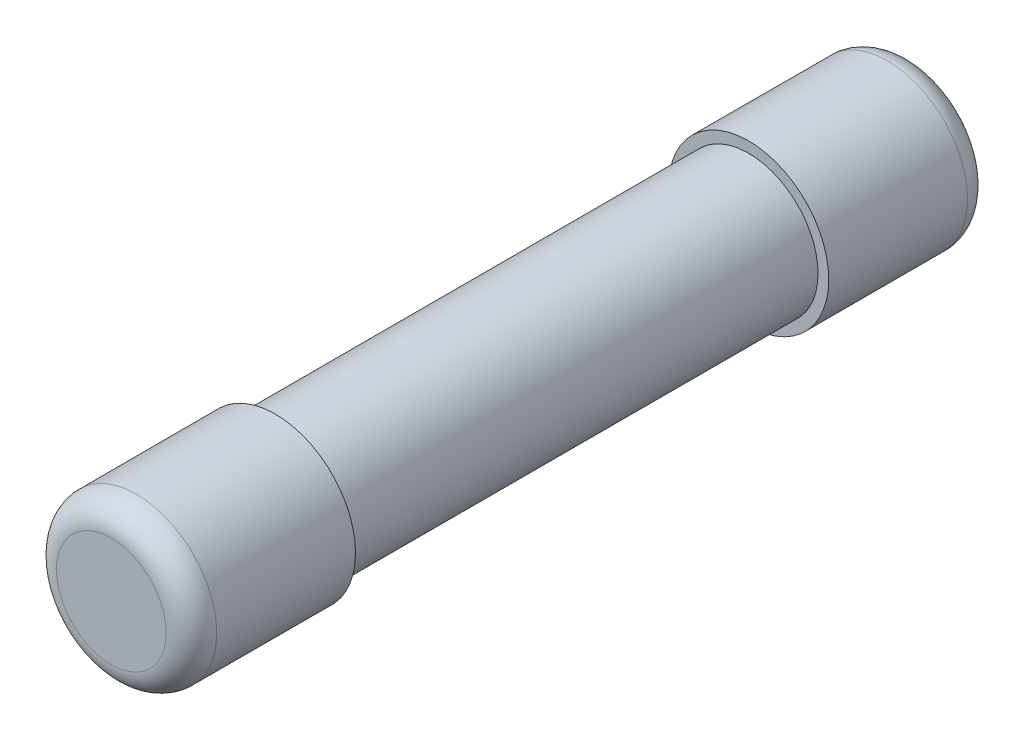
ISO-10303-21;
HEADER;
FILE_DESCRIPTION(('STEP AP214'),'2;1');
FILE_NAME('part.step','',(''),(''),'','','');
FILE_SCHEMA(('AUTOMOTIVE_DESIGN { 1 0 10303 214 1 1 1 1 }'));
ENDSEC;
DATA;
#1=APPLICATION_CONTEXT('core data for automotive mechanical design processes');
#2=APPLICATION_PROTOCOL_DEFINITION('international standard','automotive_design',2000,#1);
#3=PRODUCT_CONTEXT('',#1,'mechanical');
#4=PRODUCT('Part','Part','',(#3));
#5=PRODUCT_RELATED_PRODUCT_CATEGORY('part','',(#4));
#6=PRODUCT_DEFINITION_FORMATION('','',#4);
#7=PRODUCT_DEFINITION_CONTEXT('part definition',#1,'design');
#8=PRODUCT_DEFINITION('design','',#6,#7);
#9=PRODUCT_DEFINITION_SHAPE('','',#8);
#10=(LENGTH_UNIT() NAMED_UNIT(*) SI_UNIT(.MILLI.,.METRE.));
#11=(NAMED_UNIT(*) PLANE_ANGLE_UNIT() SI_UNIT($,.RADIAN.));
#12=(NAMED_UNIT(*) SI_UNIT($,.STERADIAN.) SOLID_ANGLE_UNIT());
#13=UNCERTAINTY_MEASURE_WITH_UNIT(LENGTH_MEASURE(1.E-05),#10,'distance_accuracy_value','');
#14=(GEOMETRIC_REPRESENTATION_CONTEXT(3) GLOBAL_UNCERTAINTY_ASSIGNED_CONTEXT((#13)) GLOBAL_UNIT_ASSIGNED_CONTEXT((#10,
#11,#12)) REPRESENTATION_CONTEXT('',''));
#15=CARTESIAN_POINT('',(0.,0.,0.));
#16=DIRECTION('',(0.,0.,1.));
#17=DIRECTION('',(1.,0.,0.));
#18=AXIS2_PLACEMENT_3D('',#15,#16,#17);
#19=CARTESIAN_POINT('',(0.,0.,-15.875));
#20=DIRECTION('',(0.,0.,-1.));
#21=DIRECTION('',(1.,0.,0.));
#22=AXIS2_PLACEMENT_3D('',#19,#20,#21);
#23=CYLINDRICAL_SURFACE('',#22,2.74955);
#24=CARTESIAN_POINT('',(0.,0.,-9.375775));
#25=DIRECTION('',(0.,0.,1.));
#26=DIRECTION('',(1.,0.,0.));
#27=AXIS2_PLACEMENT_3D('',#24,#25,#26);
#28=CIRCLE('',#27,2.74955);
#29=CARTESIAN_POINT('',(2.74955,0.,-9.375775));
#30=VERTEX_POINT('',#29);
#31=EDGE_CURVE('E64',#30,#30,#28,.T.);
#32=ORIENTED_EDGE('',*,*,#31,.T.);
#33=EDGE_LOOP('',(#32));
#34=FACE_BOUND('',#33,.T.);
#35=CARTESIAN_POINT('',(0.,0.,-14.84391875));
#36=DIRECTION('',(0.,0.,1.));
#37=DIRECTION('',(1.,0.,0.));
#38=AXIS2_PLACEMENT_3D('',#35,#36,#37);
#39=CIRCLE('',#38,2.74955);
#40=CARTESIAN_POINT('',(2.74955,0.,-14.84391875));
#41=VERTEX_POINT('',#40);
#42=EDGE_CURVE('E76',#41,#41,#39,.T.);
#43=ORIENTED_EDGE('',*,*,#42,.F.);
#44=EDGE_LOOP('',(#43));
#45=FACE_BOUND('',#44,.T.);
#46=ADVANCED_FACE('F50',(#34,#45),#23,.F.);
#47=CARTESIAN_POINT('',(0.,2.74955,-9.375775));
#48=DIRECTION('',(0.,0.,-1.));
#49=DIRECTION('',(1.,0.,0.));
#50=AXIS2_PLACEMENT_3D('',#47,#48,#49);
#51=PLANE('',#50);
#52=CARTESIAN_POINT('',(0.,0.,-9.375775));
#53=DIRECTION('',(0.,0.,1.));
#54=DIRECTION('',(1.,0.,0.));
#55=AXIS2_PLACEMENT_3D('',#52,#53,#54);
#56=CIRCLE('',#55,3.17500000000006);
#57=CARTESIAN_POINT('',(3.17500000000006,0.,-9.375775));
#58=VERTEX_POINT('',#57);
#59=EDGE_CURVE('E70',#58,#58,#56,.T.);
#60=ORIENTED_EDGE('',*,*,#59,.T.);
#61=EDGE_LOOP('',(#60));
#62=FACE_BOUND('',#61,.T.);
#63=ORIENTED_EDGE('',*,*,#31,.F.);
#64=EDGE_LOOP('',(#63));
#65=FACE_BOUND('',#64,.T.);
#66=ADVANCED_FACE('F85',(#62,#65),#51,.F.);
#67=CARTESIAN_POINT('',(0.,0.,-15.875));
#68=DIRECTION('',(0.,0.,-1.));
#69=DIRECTION('',(1.,0.,0.));
#70=AXIS2_PLACEMENT_3D('',#67,#68,#69);
#71=CYLINDRICAL_SURFACE('',#70,3.17500000000006);
#72=CARTESIAN_POINT('',(0.,0.,-14.875));
#73=DIRECTION('',(0.,0.,-1.));
#74=DIRECTION('',(-1.,0.,0.));
#75=AXIS2_PLACEMENT_3D('',#72,#73,#74);
#76=CIRCLE('',#75,3.17500000000006);
#77=CARTESIAN_POINT('',(-3.17500000000006,0.,-14.875));
#78=VERTEX_POINT('',#77);
#79=EDGE_CURVE('E11',#78,#78,#76,.T.);
#80=ORIENTED_EDGE('',*,*,#79,.F.);
#81=EDGE_LOOP('',(#80));
#82=FACE_BOUND('',#81,.T.);
#83=ORIENTED_EDGE('',*,*,#59,.F.);
#84=EDGE_LOOP('',(#83));
#85=FACE_BOUND('',#84,.T.);
#86=ADVANCED_FACE('F90',(#82,#85),#71,.T.);
#87=CARTESIAN_POINT('',(0.,3.17500000000006,-15.875));
#88=DIRECTION('',(0.,0.,1.));
#89=DIRECTION('',(-1.,0.,0.));
#90=AXIS2_PLACEMENT_3D('',#87,#88,#89);
#91=PLANE('',#90);
#92=CARTESIAN_POINT('',(0.,0.,-15.875));
#93=DIRECTION('',(0.,0.,-1.));
#94=DIRECTION('',(-1.,0.,0.));
#95=AXIS2_PLACEMENT_3D('',#92,#93,#94);
#96=CIRCLE('',#95,2.17500000000006);
#97=CARTESIAN_POINT('',(-2.17500000000006,0.,-15.875));
#98=VERTEX_POINT('',#97);
#99=EDGE_CURVE('E58',#98,#98,#96,.F.);
#100=ORIENTED_EDGE('',*,*,#99,.F.);
#101=EDGE_LOOP('',(#100));
#102=FACE_BOUND('',#101,.T.);
#103=ADVANCED_FACE('F96',(#102),#91,.F.);
#104=CARTESIAN_POINT('',(0.,0.,-14.84391875));
#105=DIRECTION('',(0.,0.,-1.));
#106=DIRECTION('',(1.,0.,0.));
#107=AXIS2_PLACEMENT_3D('',#104,#105,#106);
#108=PLANE('',#107);
#109=ORIENTED_EDGE('',*,*,#42,.T.);
#110=EDGE_LOOP('',(#109));
#111=FACE_BOUND('',#110,.T.);
#112=ADVANCED_FACE('F82',(#111),#108,.F.);
#113=CARTESIAN_POINT('',(0.,0.,-14.875));
#114=DIRECTION('',(0.,0.,1.));
#115=DIRECTION('',(-1.,0.,0.));
#116=AXIS2_PLACEMENT_3D('',#113,#114,#115);
#117=TOROIDAL_SURFACE('',#116,2.17500000000006,1.);
#118=ORIENTED_EDGE('',*,*,#79,.T.);
#119=EDGE_LOOP('',(#118));
#120=FACE_BOUND('',#119,.T.);
#121=ORIENTED_EDGE('',*,*,#99,.T.);
#122=EDGE_LOOP('',(#121));
#123=FACE_BOUND('',#122,.T.);
#124=ADVANCED_FACE('F52',(#120,#123),#117,.T.);
#125=CLOSED_SHELL('',(#46,#66,#86,#103,#112,#124));
#126=MANIFOLD_SOLID_BREP('B2',#125);
#127=CARTESIAN_POINT('',(0.,0.,15.875));
#128=DIRECTION('',(0.,0.,1.));
#129=DIRECTION('',(1.,0.,0.));
#130=AXIS2_PLACEMENT_3D('',#127,#128,#129);
#131=CYLINDRICAL_SURFACE('',#130,2.74955);
#132=CARTESIAN_POINT('',(0.,0.,9.375775));
#133=DIRECTION('',(0.,0.,1.));
#134=DIRECTION('',(1.,0.,0.));
#135=AXIS2_PLACEMENT_3D('',#132,#133,#134);
#136=CIRCLE('',#135,2.74955);
#137=CARTESIAN_POINT('',(2.74955,0.,9.375775));
#138=VERTEX_POINT('',#137);
#139=EDGE_CURVE('E167',#138,#138,#136,.T.);
#140=ORIENTED_EDGE('',*,*,#139,.F.);
#141=EDGE_LOOP('',(#140));
#142=FACE_BOUND('',#141,.T.);
#143=CARTESIAN_POINT('',(0.,0.,14.84391875));
#144=DIRECTION('',(0.,0.,1.));
#145=DIRECTION('',(1.,0.,0.));
#146=AXIS2_PLACEMENT_3D('',#143,#144,#145);
#147=CIRCLE('',#146,2.74955);
#148=CARTESIAN_POINT('',(2.74955,0.,14.84391875));
#149=VERTEX_POINT('',#148);
#150=EDGE_CURVE('E179',#149,#149,#147,.T.);
#151=ORIENTED_EDGE('',*,*,#150,.T.);
#152=EDGE_LOOP('',(#151));
#153=FACE_BOUND('',#152,.T.);
#154=ADVANCED_FACE('F153',(#142,#153),#131,.F.);
#155=CARTESIAN_POINT('',(0.,2.74955,9.375775));
#156=DIRECTION('',(0.,0.,1.));
#157=DIRECTION('',(1.,0.,0.));
#158=AXIS2_PLACEMENT_3D('',#155,#156,#157);
#159=PLANE('',#158);
#160=CARTESIAN_POINT('',(0.,0.,9.375775));
#161=DIRECTION('',(0.,0.,1.));
#162=DIRECTION('',(1.,0.,0.));
#163=AXIS2_PLACEMENT_3D('',#160,#161,#162);
#164=CIRCLE('',#163,3.17500000000006);
#165=CARTESIAN_POINT('',(3.17500000000006,0.,9.375775));
#166=VERTEX_POINT('',#165);
#167=EDGE_CURVE('E173',#166,#166,#164,.T.);
#168=ORIENTED_EDGE('',*,*,#167,.F.);
#169=EDGE_LOOP('',(#168));
#170=FACE_BOUND('',#169,.T.);
#171=ORIENTED_EDGE('',*,*,#139,.T.);
#172=EDGE_LOOP('',(#171));
#173=FACE_BOUND('',#172,.T.);
#174=ADVANCED_FACE('F198',(#170,#173),#159,.F.);
#175=CARTESIAN_POINT('',(0.,0.,15.875));
#176=DIRECTION('',(0.,0.,1.));
#177=DIRECTION('',(1.,0.,0.));
#178=AXIS2_PLACEMENT_3D('',#175,#176,#177);
#179=CYLINDRICAL_SURFACE('',#178,3.17500000000006);
#180=CARTESIAN_POINT('',(0.,0.,14.875));
#181=DIRECTION('',(0.,0.,-1.));
#182=DIRECTION('',(-1.,0.,0.));
#183=AXIS2_PLACEMENT_3D('',#180,#181,#182);
#184=CIRCLE('',#183,3.17500000000006);
#185=CARTESIAN_POINT('',(-3.17500000000006,0.,14.875));
#186=VERTEX_POINT('',#185);
#187=EDGE_CURVE('E49',#186,#186,#184,.T.);
#188=ORIENTED_EDGE('',*,*,#187,.T.);
#189=EDGE_LOOP('',(#188));
#190=FACE_BOUND('',#189,.T.);
#191=ORIENTED_EDGE('',*,*,#167,.T.);
#192=EDGE_LOOP('',(#191));
#193=FACE_BOUND('',#192,.T.);
#194=ADVANCED_FACE('F195',(#190,#193),#179,.T.);
#195=CARTESIAN_POINT('',(0.,3.17500000000006,15.875));
#196=DIRECTION('',(0.,0.,-1.));
#197=DIRECTION('',(-1.,0.,0.));
#198=AXIS2_PLACEMENT_3D('',#195,#196,#197);
#199=PLANE('',#198);
#200=CARTESIAN_POINT('',(0.,0.,15.875));
#201=DIRECTION('',(0.,0.,-1.));
#202=DIRECTION('',(-1.,0.,0.));
#203=AXIS2_PLACEMENT_3D('',#200,#201,#202);
#204=CIRCLE('',#203,2.17500000000006);
#205=CARTESIAN_POINT('',(-2.17500000000006,0.,15.875));
#206=VERTEX_POINT('',#205);
#207=EDGE_CURVE('E161',#206,#206,#204,.F.);
#208=ORIENTED_EDGE('',*,*,#207,.T.);
#209=EDGE_LOOP('',(#208));
#210=FACE_BOUND('',#209,.T.);
#211=ADVANCED_FACE('F188',(#210),#199,.F.);
#212=CARTESIAN_POINT('',(0.,0.,14.84391875));
#213=DIRECTION('',(0.,0.,1.));
#214=DIRECTION('',(1.,0.,0.));
#215=AXIS2_PLACEMENT_3D('',#212,#213,#214);
#216=PLANE('',#215);
#217=ORIENTED_EDGE('',*,*,#150,.F.);
#218=EDGE_LOOP('',(#217));
#219=FACE_BOUND('',#218,.T.);
#220=ADVANCED_FACE('F186',(#219),#216,.F.);
#221=CARTESIAN_POINT('',(0.,0.,14.875));
#222=DIRECTION('',(0.,0.,-1.));
#223=DIRECTION('',(-1.,0.,0.));
#224=AXIS2_PLACEMENT_3D('',#221,#222,#223);
#225=TOROIDAL_SURFACE('',#224,2.17500000000006,1.);
#226=ORIENTED_EDGE('',*,*,#187,.F.);
#227=EDGE_LOOP('',(#226));
#228=FACE_BOUND('',#227,.T.);
#229=ORIENTED_EDGE('',*,*,#207,.F.);
#230=EDGE_LOOP('',(#229));
#231=FACE_BOUND('',#230,.T.);
#232=ADVANCED_FACE('F155',(#228,#231),#225,.T.);
#233=CLOSED_SHELL('',(#154,#174,#194,#211,#220,#232));
#234=MANIFOLD_SOLID_BREP('B6',#233);
#235=CARTESIAN_POINT('',(0.,1.71846875,14.84391875));
#236=DIRECTION('',(0.,0.,-1.));
#237=DIRECTION('',(-1.,0.,0.));
#238=AXIS2_PLACEMENT_3D('',#235,#236,#237);
#239=PLANE('',#238);
#240=CARTESIAN_POINT('',(0.,0.,14.84391875));
#241=DIRECTION('',(0.,0.,1.));
#242=DIRECTION('',(1.,0.,0.));
#243=AXIS2_PLACEMENT_3D('',#240,#241,#242);
#244=CIRCLE('',#243,1.71846875);
#245=CARTESIAN_POINT('',(1.71846875,0.,14.84391875));
#246=VERTEX_POINT('',#245);
#247=EDGE_CURVE('E268',#246,#246,#244,.T.);
#248=ORIENTED_EDGE('',*,*,#247,.F.);
#249=EDGE_LOOP('',(#248));
#250=FACE_BOUND('',#249,.T.);
#251=CARTESIAN_POINT('',(0.,0.,14.84391875));
#252=DIRECTION('',(0.,0.,1.));
#253=DIRECTION('',(1.,0.,0.));
#254=AXIS2_PLACEMENT_3D('',#251,#252,#253);
#255=CIRCLE('',#254,2.74955);
#256=CARTESIAN_POINT('',(2.74955,0.,14.84391875));
#257=VERTEX_POINT('',#256);
#258=EDGE_CURVE('E152',#257,#257,#255,.T.);
#259=ORIENTED_EDGE('',*,*,#258,.T.);
#260=EDGE_LOOP('',(#259));
#261=FACE_BOUND('',#260,.T.);
#262=ADVANCED_FACE('F249',(#250,#261),#239,.F.);
#263=CARTESIAN_POINT('',(0.,0.,15.875));
#264=DIRECTION('',(0.,0.,1.));
#265=DIRECTION('',(1.,0.,0.));
#266=AXIS2_PLACEMENT_3D('',#263,#264,#265);
#267=CYLINDRICAL_SURFACE('',#266,2.74955);
#268=ORIENTED_EDGE('',*,*,#258,.F.);
#269=EDGE_LOOP('',(#268));
#270=FACE_BOUND('',#269,.T.);
#271=CARTESIAN_POINT('',(0.,0.,-14.84391875));
#272=DIRECTION('',(0.,0.,1.));
#273=DIRECTION('',(1.,0.,0.));
#274=AXIS2_PLACEMENT_3D('',#271,#272,#273);
#275=CIRCLE('',#274,2.74955);
#276=CARTESIAN_POINT('',(2.74955,0.,-14.84391875));
#277=VERTEX_POINT('',#276);
#278=EDGE_CURVE('E256',#277,#277,#275,.T.);
#279=ORIENTED_EDGE('',*,*,#278,.T.);
#280=EDGE_LOOP('',(#279));
#281=FACE_BOUND('',#280,.T.);
#282=ADVANCED_FACE('F279',(#270,#281),#267,.T.);
#283=CARTESIAN_POINT('',(0.,1.71846875,-14.84391875));
#284=DIRECTION('',(0.,0.,1.));
#285=DIRECTION('',(1.,0.,0.));
#286=AXIS2_PLACEMENT_3D('',#283,#284,#285);
#287=PLANE('',#286);
#288=ORIENTED_EDGE('',*,*,#278,.F.);
#289=EDGE_LOOP('',(#288));
#290=FACE_BOUND('',#289,.T.);
#291=CARTESIAN_POINT('',(0.,0.,-14.84391875));
#292=DIRECTION('',(0.,0.,1.));
#293=DIRECTION('',(1.,0.,0.));
#294=AXIS2_PLACEMENT_3D('',#291,#292,#293);
#295=CIRCLE('',#294,1.71846875);
#296=CARTESIAN_POINT('',(1.71846875,0.,-14.84391875));
#297=VERTEX_POINT('',#296);
#298=EDGE_CURVE('E262',#297,#297,#295,.T.);
#299=ORIENTED_EDGE('',*,*,#298,.T.);
#300=EDGE_LOOP('',(#299));
#301=FACE_BOUND('',#300,.T.);
#302=ADVANCED_FACE('F283',(#290,#301),#287,.F.);
#303=CARTESIAN_POINT('',(0.,0.,15.875));
#304=DIRECTION('',(0.,0.,1.));
#305=DIRECTION('',(1.,0.,0.));
#306=AXIS2_PLACEMENT_3D('',#303,#304,#305);
#307=CYLINDRICAL_SURFACE('',#306,1.71846875);
#308=ORIENTED_EDGE('',*,*,#298,.F.);
#309=EDGE_LOOP('',(#308));
#310=FACE_BOUND('',#309,.T.);
#311=ORIENTED_EDGE('',*,*,#247,.T.);
#312=EDGE_LOOP('',(#311));
#313=FACE_BOUND('',#312,.T.);
#314=ADVANCED_FACE('F276',(#310,#313),#307,.F.);
#315=CLOSED_SHELL('',(#262,#282,#302,#314));
#316=MANIFOLD_SOLID_BREP('B44',#315);
#317=ADVANCED_BREP_SHAPE_REPRESENTATION('',(#18,#126,#234,#316),#14);
#318=SHAPE_DEFINITION_REPRESENTATION(#9,#317);
ENDSEC;
END-ISO-10303-21;
